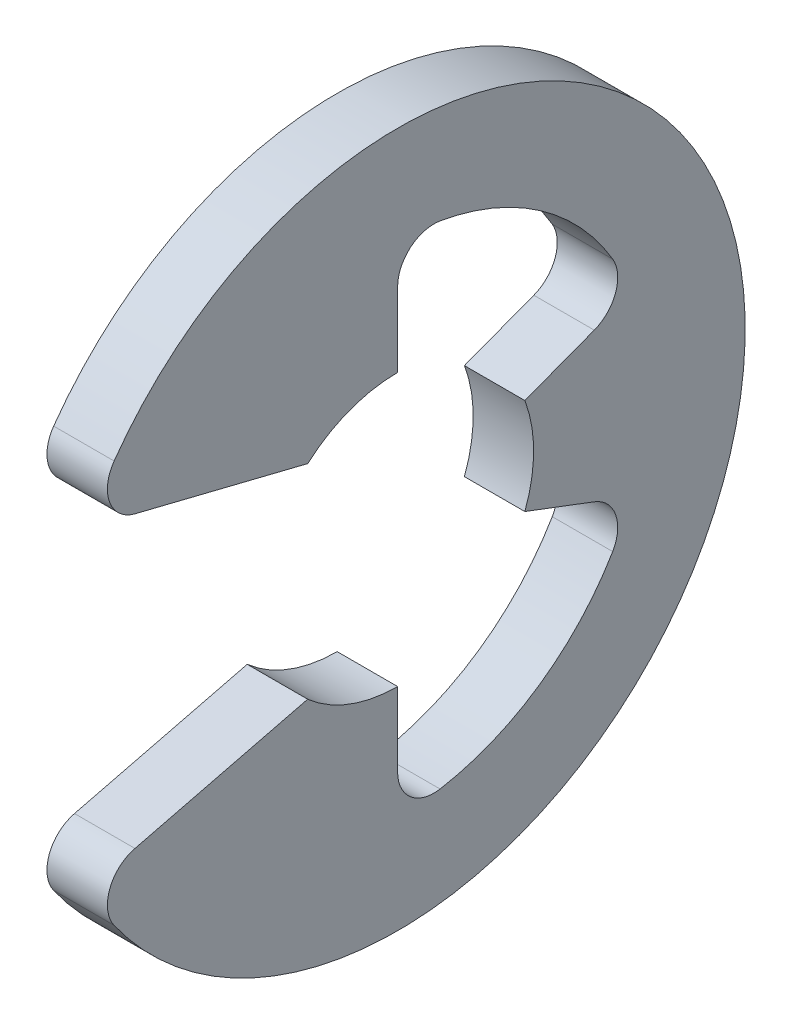
ISO-10303-21;
HEADER;
FILE_DESCRIPTION(('STEP AP214'),'2;1');
FILE_NAME('part.step','',(''),(''),'','','');
FILE_SCHEMA(('AUTOMOTIVE_DESIGN { 1 0 10303 214 1 1 1 1 }'));
ENDSEC;
DATA;
#1=APPLICATION_CONTEXT('core data for automotive mechanical design processes');
#2=APPLICATION_PROTOCOL_DEFINITION('international standard','automotive_design',2000,#1);
#3=PRODUCT_CONTEXT('',#1,'mechanical');
#4=PRODUCT('Part','Part','',(#3));
#5=PRODUCT_RELATED_PRODUCT_CATEGORY('part','',(#4));
#6=PRODUCT_DEFINITION_FORMATION('','',#4);
#7=PRODUCT_DEFINITION_CONTEXT('part definition',#1,'design');
#8=PRODUCT_DEFINITION('design','',#6,#7);
#9=PRODUCT_DEFINITION_SHAPE('','',#8);
#10=(LENGTH_UNIT() NAMED_UNIT(*) SI_UNIT(.MILLI.,.METRE.));
#11=(NAMED_UNIT(*) PLANE_ANGLE_UNIT() SI_UNIT($,.RADIAN.));
#12=(NAMED_UNIT(*) SI_UNIT($,.STERADIAN.) SOLID_ANGLE_UNIT());
#13=UNCERTAINTY_MEASURE_WITH_UNIT(LENGTH_MEASURE(1.E-05),#10,'distance_accuracy_value','');
#14=(GEOMETRIC_REPRESENTATION_CONTEXT(3) GLOBAL_UNCERTAINTY_ASSIGNED_CONTEXT((#13)) GLOBAL_UNIT_ASSIGNED_CONTEXT((#10,
#11,#12)) REPRESENTATION_CONTEXT('',''));
#15=CARTESIAN_POINT('',(0.,0.,0.));
#16=DIRECTION('',(0.,0.,1.));
#17=DIRECTION('',(1.,0.,0.));
#18=AXIS2_PLACEMENT_3D('',#15,#16,#17);
#19=CARTESIAN_POINT('',(0.3,0.,0.));
#20=DIRECTION('',(-1.,0.,0.));
#21=DIRECTION('',(0.,0.,1.));
#22=AXIS2_PLACEMENT_3D('',#19,#20,#21);
#23=CYLINDRICAL_SURFACE('',#22,3.45);
#24=CARTESIAN_POINT('',(0.3,0.,0.));
#25=DIRECTION('',(1.,0.,0.));
#26=DIRECTION('',(0.,0.,-1.));
#27=AXIS2_PLACEMENT_3D('',#24,#25,#26);
#28=CIRCLE('',#27,3.45);
#29=CARTESIAN_POINT('',(0.3,-1.99575242284903,2.8141556933994));
#30=VERTEX_POINT('',#29);
#31=CARTESIAN_POINT('',(0.3,1.99575242284903,2.8141556933994));
#32=VERTEX_POINT('',#31);
#33=EDGE_CURVE('E179',#30,#32,#28,.T.);
#34=ORIENTED_EDGE('',*,*,#33,.F.);
#35=DIRECTION('',(-1.,0.,0.));
#36=VECTOR('',#35,1.);
#37=CARTESIAN_POINT('',(0.3,-1.99575242284903,2.8141556933994));
#38=LINE('',#37,#36);
#39=CARTESIAN_POINT('',(-0.3,-1.99575242284903,2.8141556933994));
#40=VERTEX_POINT('',#39);
#41=EDGE_CURVE('E273',#30,#40,#38,.T.);
#42=ORIENTED_EDGE('',*,*,#41,.T.);
#43=CARTESIAN_POINT('',(-0.3,0.,0.));
#44=DIRECTION('',(1.,0.,0.));
#45=DIRECTION('',(0.,0.,-1.));
#46=AXIS2_PLACEMENT_3D('',#43,#44,#45);
#47=CIRCLE('',#46,3.45);
#48=CARTESIAN_POINT('',(-0.3,1.99575242284903,2.8141556933994));
#49=VERTEX_POINT('',#48);
#50=EDGE_CURVE('E217',#40,#49,#47,.T.);
#51=ORIENTED_EDGE('',*,*,#50,.T.);
#52=DIRECTION('',(-1.,0.,0.));
#53=VECTOR('',#52,1.);
#54=CARTESIAN_POINT('',(0.3,1.99575242284903,2.8141556933994));
#55=LINE('',#54,#53);
#56=EDGE_CURVE('E271',#49,#32,#55,.F.);
#57=ORIENTED_EDGE('',*,*,#56,.T.);
#58=EDGE_LOOP('',(#34,#42,#51,#57));
#59=FACE_BOUND('',#58,.T.);
#60=ADVANCED_FACE('F41',(#59),#23,.T.);
#61=CARTESIAN_POINT('',(0.3,1.55535385551941,3.07950878942095));
#62=DIRECTION('',(0.,0.970536829925373,-0.240952820606871));
#63=DIRECTION('',(0.,0.240952820606871,0.970536829925373));
#64=AXIS2_PLACEMENT_3D('',#61,#62,#63);
#65=PLANE('',#64);
#66=DIRECTION('',(0.,-0.240952820606871,-0.970536829925373));
#67=VECTOR('',#66,1.);
#68=CARTESIAN_POINT('',(0.3,1.55535385551941,3.07950878942095));
#69=LINE('',#68,#67);
#70=CARTESIAN_POINT('',(0.3,1.43810673734382,2.60724767994141));
#71=VERTEX_POINT('',#70);
#72=CARTESIAN_POINT('',(0.3,1.0125,0.8929410674843));
#73=VERTEX_POINT('',#72);
#74=EDGE_CURVE('E165',#71,#73,#69,.T.);
#75=ORIENTED_EDGE('',*,*,#74,.F.);
#76=DIRECTION('',(-1.,0.,0.));
#77=VECTOR('',#76,1.);
#78=CARTESIAN_POINT('',(0.3,1.43810673734382,2.60724767994141));
#79=LINE('',#78,#77);
#80=CARTESIAN_POINT('',(-0.3,1.43810673734382,2.60724767994141));
#81=VERTEX_POINT('',#80);
#82=EDGE_CURVE('E285',#71,#81,#79,.T.);
#83=ORIENTED_EDGE('',*,*,#82,.T.);
#84=DIRECTION('',(0.,-0.240952820606871,-0.970536829925373));
#85=VECTOR('',#84,1.);
#86=CARTESIAN_POINT('',(-0.3,1.55535385551941,3.07950878942095));
#87=LINE('',#86,#85);
#88=CARTESIAN_POINT('',(-0.3,1.0125,0.8929410674843));
#89=VERTEX_POINT('',#88);
#90=EDGE_CURVE('E185',#81,#89,#87,.T.);
#91=ORIENTED_EDGE('',*,*,#90,.T.);
#92=DIRECTION('',(-1.,0.,0.));
#93=VECTOR('',#92,1.);
#94=CARTESIAN_POINT('',(0.3,1.0125,0.8929410674843));
#95=LINE('',#94,#93);
#96=EDGE_CURVE('E182',#73,#89,#95,.T.);
#97=ORIENTED_EDGE('',*,*,#96,.F.);
#98=EDGE_LOOP('',(#75,#83,#91,#97));
#99=FACE_BOUND('',#98,.T.);
#100=ADVANCED_FACE('F183',(#99),#65,.F.);
#101=CARTESIAN_POINT('',(0.3,0.,0.));
#102=DIRECTION('',(-1.,0.,0.));
#103=DIRECTION('',(0.,0.,1.));
#104=AXIS2_PLACEMENT_3D('',#101,#102,#103);
#105=CYLINDRICAL_SURFACE('',#104,1.35);
#106=CARTESIAN_POINT('',(-0.3,0.,0.));
#107=DIRECTION('',(-1.,0.,0.));
#108=DIRECTION('',(0.,0.,1.));
#109=AXIS2_PLACEMENT_3D('',#106,#107,#108);
#110=CIRCLE('',#109,1.35);
#111=CARTESIAN_POINT('',(-0.3,1.35,0.));
#112=VERTEX_POINT('',#111);
#113=EDGE_CURVE('E221',#89,#112,#110,.T.);
#114=ORIENTED_EDGE('',*,*,#113,.T.);
#115=DIRECTION('',(-1.,0.,0.));
#116=VECTOR('',#115,1.);
#117=CARTESIAN_POINT('',(0.3,1.35,0.));
#118=LINE('',#117,#116);
#119=CARTESIAN_POINT('',(0.3,1.35,0.));
#120=VERTEX_POINT('',#119);
#121=EDGE_CURVE('E189',#120,#112,#118,.T.);
#122=ORIENTED_EDGE('',*,*,#121,.F.);
#123=CARTESIAN_POINT('',(0.3,0.,0.));
#124=DIRECTION('',(-1.,0.,0.));
#125=DIRECTION('',(0.,0.,1.));
#126=AXIS2_PLACEMENT_3D('',#123,#124,#125);
#127=CIRCLE('',#126,1.35);
#128=EDGE_CURVE('E171',#73,#120,#127,.T.);
#129=ORIENTED_EDGE('',*,*,#128,.F.);
#130=ORIENTED_EDGE('',*,*,#96,.T.);
#131=EDGE_LOOP('',(#114,#122,#129,#130));
#132=FACE_BOUND('',#131,.T.);
#133=ADVANCED_FACE('F191',(#132),#105,.F.);
#134=CARTESIAN_POINT('',(0.3,1.35,0.));
#135=DIRECTION('',(0.,0.,1.));
#136=DIRECTION('',(0.,-1.,0.));
#137=AXIS2_PLACEMENT_3D('',#134,#135,#136);
#138=PLANE('',#137);
#139=DIRECTION('',(0.,1.,0.));
#140=VECTOR('',#139,1.);
#141=CARTESIAN_POINT('',(-0.3,1.35,0.));
#142=LINE('',#141,#140);
#143=CARTESIAN_POINT('',(-0.3,2.08659165249111,0.));
#144=VERTEX_POINT('',#143);
#145=EDGE_CURVE('E223',#112,#144,#142,.T.);
#146=ORIENTED_EDGE('',*,*,#145,.T.);
#147=DIRECTION('',(1.,0.,0.));
#148=VECTOR('',#147,1.);
#149=CARTESIAN_POINT('',(0.3,2.08659165249111,0.));
#150=LINE('',#149,#148);
#151=CARTESIAN_POINT('',(0.3,2.08659165249111,0.));
#152=VERTEX_POINT('',#151);
#153=EDGE_CURVE('E269',#144,#152,#150,.T.);
#154=ORIENTED_EDGE('',*,*,#153,.T.);
#155=DIRECTION('',(0.,1.,0.));
#156=VECTOR('',#155,1.);
#157=CARTESIAN_POINT('',(0.3,1.35,0.));
#158=LINE('',#157,#156);
#159=EDGE_CURVE('E194',#120,#152,#158,.T.);
#160=ORIENTED_EDGE('',*,*,#159,.F.);
#161=ORIENTED_EDGE('',*,*,#121,.T.);
#162=EDGE_LOOP('',(#146,#154,#160,#161));
#163=FACE_BOUND('',#162,.T.);
#164=ADVANCED_FACE('F393',(#163),#138,.F.);
#165=CARTESIAN_POINT('',(0.3,0.,0.));
#166=DIRECTION('',(-1.,0.,0.));
#167=DIRECTION('',(0.,0.,1.));
#168=AXIS2_PLACEMENT_3D('',#165,#166,#167);
#169=CYLINDRICAL_SURFACE('',#168,2.47741935483871);
#170=CARTESIAN_POINT('',(0.3,0.,0.));
#171=DIRECTION('',(-1.,0.,0.));
#172=DIRECTION('',(0.,0.,-1.));
#173=AXIS2_PLACEMENT_3D('',#170,#171,#172);
#174=CIRCLE('',#173,2.47741935483871);
#175=CARTESIAN_POINT('',(0.3,2.44135037951428,-0.421206581352832));
#176=VERTEX_POINT('',#175);
#177=CARTESIAN_POINT('',(0.3,1.25715038342261,-2.13475515532574));
#178=VERTEX_POINT('',#177);
#179=EDGE_CURVE('E196',#176,#178,#174,.T.);
#180=ORIENTED_EDGE('',*,*,#179,.F.);
#181=DIRECTION('',(-1.,0.,0.));
#182=VECTOR('',#181,1.);
#183=CARTESIAN_POINT('',(0.3,2.44135037951428,-0.421206581352832));
#184=LINE('',#183,#182);
#185=CARTESIAN_POINT('',(-0.3,2.44135037951428,-0.421206581352832));
#186=VERTEX_POINT('',#185);
#187=EDGE_CURVE('E266',#176,#186,#184,.T.);
#188=ORIENTED_EDGE('',*,*,#187,.T.);
#189=CARTESIAN_POINT('',(-0.3,0.,0.));
#190=DIRECTION('',(-1.,0.,0.));
#191=DIRECTION('',(0.,0.,-1.));
#192=AXIS2_PLACEMENT_3D('',#189,#190,#191);
#193=CIRCLE('',#192,2.47741935483871);
#194=CARTESIAN_POINT('',(-0.3,1.25715038342261,-2.13475515532574));
#195=VERTEX_POINT('',#194);
#196=EDGE_CURVE('E226',#186,#195,#193,.T.);
#197=ORIENTED_EDGE('',*,*,#196,.T.);
#198=DIRECTION('',(-1.,0.,0.));
#199=VECTOR('',#198,1.);
#200=CARTESIAN_POINT('',(0.3,1.25715038342261,-2.13475515532574));
#201=LINE('',#200,#199);
#202=EDGE_CURVE('E264',#195,#178,#201,.F.);
#203=ORIENTED_EDGE('',*,*,#202,.T.);
#204=EDGE_LOOP('',(#180,#188,#197,#203));
#205=FACE_BOUND('',#204,.T.);
#206=ADVANCED_FACE('F313',(#205),#169,.F.);
#207=CARTESIAN_POINT('',(0.3,0.477297077300919,-1.26280936803621));
#208=DIRECTION('',(0.,-0.935414346693484,-0.353553390593278));
#209=DIRECTION('',(0.,0.353553390593278,-0.935414346693484));
#210=AXIS2_PLACEMENT_3D('',#207,#208,#209);
#211=PLANE('',#210);
#212=DIRECTION('',(0.,-0.353553390593278,0.935414346693484));
#213=VECTOR('',#212,1.);
#214=CARTESIAN_POINT('',(0.3,0.477297077300919,-1.26280936803621));
#215=LINE('',#214,#213);
#216=CARTESIAN_POINT('',(0.3,0.737721553521856,-1.95182776743105));
#217=VERTEX_POINT('',#216);
#218=CARTESIAN_POINT('',(0.3,0.477297077300919,-1.26280936803621));
#219=VERTEX_POINT('',#218);
#220=EDGE_CURVE('E201',#217,#219,#215,.T.);
#221=ORIENTED_EDGE('',*,*,#220,.F.);
#222=DIRECTION('',(1.,0.,0.));
#223=VECTOR('',#222,1.);
#224=CARTESIAN_POINT('',(-0.3,0.737721553521856,-1.95182776743105));
#225=LINE('',#224,#223);
#226=CARTESIAN_POINT('',(-0.3,0.737721553521856,-1.95182776743105));
#227=VERTEX_POINT('',#226);
#228=EDGE_CURVE('E288',#217,#227,#225,.F.);
#229=ORIENTED_EDGE('',*,*,#228,.T.);
#230=DIRECTION('',(0.,-0.353553390593278,0.935414346693484));
#231=VECTOR('',#230,1.);
#232=CARTESIAN_POINT('',(-0.3,0.477297077300919,-1.26280936803621));
#233=LINE('',#232,#231);
#234=CARTESIAN_POINT('',(-0.3,0.477297077300919,-1.26280936803621));
#235=VERTEX_POINT('',#234);
#236=EDGE_CURVE('E229',#227,#235,#233,.T.);
#237=ORIENTED_EDGE('',*,*,#236,.T.);
#238=DIRECTION('',(-1.,0.,0.));
#239=VECTOR('',#238,1.);
#240=CARTESIAN_POINT('',(0.3,0.477297077300919,-1.26280936803621));
#241=LINE('',#240,#239);
#242=EDGE_CURVE('E253',#219,#235,#241,.T.);
#243=ORIENTED_EDGE('',*,*,#242,.F.);
#244=EDGE_LOOP('',(#221,#229,#237,#243));
#245=FACE_BOUND('',#244,.T.);
#246=ADVANCED_FACE('F316',(#245),#211,.F.);
#247=CARTESIAN_POINT('',(0.3,0.,0.));
#248=DIRECTION('',(-1.,0.,0.));
#249=DIRECTION('',(0.,0.,1.));
#250=AXIS2_PLACEMENT_3D('',#247,#248,#249);
#251=CYLINDRICAL_SURFACE('',#250,1.35);
#252=CARTESIAN_POINT('',(-0.3,0.,0.));
#253=DIRECTION('',(-1.,0.,0.));
#254=DIRECTION('',(0.,0.,1.));
#255=AXIS2_PLACEMENT_3D('',#252,#253,#254);
#256=CIRCLE('',#255,1.35);
#257=CARTESIAN_POINT('',(-0.3,-0.477297077300919,-1.26280936803621));
#258=VERTEX_POINT('',#257);
#259=EDGE_CURVE('E231',#235,#258,#256,.T.);
#260=ORIENTED_EDGE('',*,*,#259,.T.);
#261=DIRECTION('',(-1.,0.,0.));
#262=VECTOR('',#261,1.);
#263=CARTESIAN_POINT('',(0.3,-0.477297077300919,-1.26280936803621));
#264=LINE('',#263,#262);
#265=CARTESIAN_POINT('',(0.3,-0.477297077300919,-1.26280936803621));
#266=VERTEX_POINT('',#265);
#267=EDGE_CURVE('E250',#266,#258,#264,.T.);
#268=ORIENTED_EDGE('',*,*,#267,.F.);
#269=CARTESIAN_POINT('',(0.3,0.,0.));
#270=DIRECTION('',(-1.,0.,0.));
#271=DIRECTION('',(0.,0.,1.));
#272=AXIS2_PLACEMENT_3D('',#269,#270,#271);
#273=CIRCLE('',#272,1.35);
#274=EDGE_CURVE('E203',#219,#266,#273,.T.);
#275=ORIENTED_EDGE('',*,*,#274,.F.);
#276=ORIENTED_EDGE('',*,*,#242,.T.);
#277=EDGE_LOOP('',(#260,#268,#275,#276));
#278=FACE_BOUND('',#277,.T.);
#279=ADVANCED_FACE('F322',(#278),#251,.F.);
#280=CARTESIAN_POINT('',(0.3,-0.477297077300919,-1.26280936803621));
#281=DIRECTION('',(0.,0.935414346693484,-0.353553390593277));
#282=DIRECTION('',(0.,0.353553390593277,0.935414346693484));
#283=AXIS2_PLACEMENT_3D('',#280,#281,#282);
#284=PLANE('',#283);
#285=DIRECTION('',(0.,-0.353553390593277,-0.935414346693484));
#286=VECTOR('',#285,1.);
#287=CARTESIAN_POINT('',(-0.3,-0.477297077300919,-1.26280936803621));
#288=LINE('',#287,#286);
#289=CARTESIAN_POINT('',(-0.3,-0.737721553521855,-1.95182776743105));
#290=VERTEX_POINT('',#289);
#291=EDGE_CURVE('E233',#258,#290,#288,.T.);
#292=ORIENTED_EDGE('',*,*,#291,.T.);
#293=DIRECTION('',(1.,0.,0.));
#294=VECTOR('',#293,1.);
#295=CARTESIAN_POINT('',(0.3,-0.737721553521855,-1.95182776743105));
#296=LINE('',#295,#294);
#297=CARTESIAN_POINT('',(0.3,-0.737721553521855,-1.95182776743105));
#298=VERTEX_POINT('',#297);
#299=EDGE_CURVE('E56',#290,#298,#296,.T.);
#300=ORIENTED_EDGE('',*,*,#299,.T.);
#301=DIRECTION('',(0.,-0.353553390593277,-0.935414346693484));
#302=VECTOR('',#301,1.);
#303=CARTESIAN_POINT('',(0.3,-0.477297077300919,-1.26280936803621));
#304=LINE('',#303,#302);
#305=EDGE_CURVE('E205',#266,#298,#304,.T.);
#306=ORIENTED_EDGE('',*,*,#305,.F.);
#307=ORIENTED_EDGE('',*,*,#267,.T.);
#308=EDGE_LOOP('',(#292,#300,#306,#307));
#309=FACE_BOUND('',#308,.T.);
#310=ADVANCED_FACE('F324',(#309),#284,.F.);
#311=CARTESIAN_POINT('',(0.3,0.,0.));
#312=DIRECTION('',(-1.,0.,0.));
#313=DIRECTION('',(0.,0.,1.));
#314=AXIS2_PLACEMENT_3D('',#311,#312,#313);
#315=CYLINDRICAL_SURFACE('',#314,2.47741935483871);
#316=CARTESIAN_POINT('',(-0.3,0.,0.));
#317=DIRECTION('',(-1.,0.,0.));
#318=DIRECTION('',(0.,0.,-1.));
#319=AXIS2_PLACEMENT_3D('',#316,#317,#318);
#320=CIRCLE('',#319,2.47741935483871);
#321=CARTESIAN_POINT('',(-0.3,-1.25715038342261,-2.13475515532574));
#322=VERTEX_POINT('',#321);
#323=CARTESIAN_POINT('',(-0.3,-2.44135037951428,-0.421206581352832));
#324=VERTEX_POINT('',#323);
#325=EDGE_CURVE('E235',#322,#324,#320,.T.);
#326=ORIENTED_EDGE('',*,*,#325,.T.);
#327=DIRECTION('',(-1.,0.,0.));
#328=VECTOR('',#327,1.);
#329=CARTESIAN_POINT('',(0.3,-2.44135037951428,-0.421206581352832));
#330=LINE('',#329,#328);
#331=CARTESIAN_POINT('',(0.3,-2.44135037951428,-0.421206581352832));
#332=VERTEX_POINT('',#331);
#333=EDGE_CURVE('E262',#324,#332,#330,.F.);
#334=ORIENTED_EDGE('',*,*,#333,.T.);
#335=CARTESIAN_POINT('',(0.3,0.,0.));
#336=DIRECTION('',(-1.,0.,0.));
#337=DIRECTION('',(0.,0.,-1.));
#338=AXIS2_PLACEMENT_3D('',#335,#336,#337);
#339=CIRCLE('',#338,2.47741935483871);
#340=CARTESIAN_POINT('',(0.3,-1.25715038342261,-2.13475515532574));
#341=VERTEX_POINT('',#340);
#342=EDGE_CURVE('E207',#341,#332,#339,.T.);
#343=ORIENTED_EDGE('',*,*,#342,.F.);
#344=DIRECTION('',(-1.,0.,0.));
#345=VECTOR('',#344,1.);
#346=CARTESIAN_POINT('',(0.3,-1.25715038342261,-2.13475515532574));
#347=LINE('',#346,#345);
#348=EDGE_CURVE('E259',#341,#322,#347,.T.);
#349=ORIENTED_EDGE('',*,*,#348,.T.);
#350=EDGE_LOOP('',(#326,#334,#343,#349));
#351=FACE_BOUND('',#350,.T.);
#352=ADVANCED_FACE('F326',(#351),#315,.F.);
#353=CARTESIAN_POINT('',(0.3,-1.35,0.));
#354=DIRECTION('',(0.,0.,1.));
#355=DIRECTION('',(0.,-1.,0.));
#356=AXIS2_PLACEMENT_3D('',#353,#354,#355);
#357=PLANE('',#356);
#358=DIRECTION('',(0.,1.,0.));
#359=VECTOR('',#358,1.);
#360=CARTESIAN_POINT('',(0.3,-1.35,0.));
#361=LINE('',#360,#359);
#362=CARTESIAN_POINT('',(0.3,-2.08659165249111,0.));
#363=VERTEX_POINT('',#362);
#364=CARTESIAN_POINT('',(0.3,-1.35,0.));
#365=VERTEX_POINT('',#364);
#366=EDGE_CURVE('E210',#363,#365,#361,.T.);
#367=ORIENTED_EDGE('',*,*,#366,.F.);
#368=DIRECTION('',(1.,0.,0.));
#369=VECTOR('',#368,1.);
#370=CARTESIAN_POINT('',(-0.3,-2.08659165249111,0.));
#371=LINE('',#370,#369);
#372=CARTESIAN_POINT('',(-0.3,-2.08659165249111,0.));
#373=VERTEX_POINT('',#372);
#374=EDGE_CURVE('E188',#363,#373,#371,.F.);
#375=ORIENTED_EDGE('',*,*,#374,.T.);
#376=DIRECTION('',(0.,1.,0.));
#377=VECTOR('',#376,1.);
#378=CARTESIAN_POINT('',(-0.3,-1.35,0.));
#379=LINE('',#378,#377);
#380=CARTESIAN_POINT('',(-0.3,-1.35,0.));
#381=VERTEX_POINT('',#380);
#382=EDGE_CURVE('E238',#373,#381,#379,.T.);
#383=ORIENTED_EDGE('',*,*,#382,.T.);
#384=DIRECTION('',(-1.,0.,0.));
#385=VECTOR('',#384,1.);
#386=CARTESIAN_POINT('',(0.3,-1.35,0.));
#387=LINE('',#386,#385);
#388=EDGE_CURVE('E247',#365,#381,#387,.T.);
#389=ORIENTED_EDGE('',*,*,#388,.F.);
#390=EDGE_LOOP('',(#367,#375,#383,#389));
#391=FACE_BOUND('',#390,.T.);
#392=ADVANCED_FACE('F332',(#391),#357,.F.);
#393=CARTESIAN_POINT('',(0.3,0.,0.));
#394=DIRECTION('',(-1.,0.,0.));
#395=DIRECTION('',(0.,0.,1.));
#396=AXIS2_PLACEMENT_3D('',#393,#394,#395);
#397=CYLINDRICAL_SURFACE('',#396,1.35);
#398=CARTESIAN_POINT('',(-0.3,0.,0.));
#399=DIRECTION('',(-1.,0.,0.));
#400=DIRECTION('',(0.,0.,-1.));
#401=AXIS2_PLACEMENT_3D('',#398,#399,#400);
#402=CIRCLE('',#401,1.35);
#403=CARTESIAN_POINT('',(-0.3,-1.0125,0.8929410674843));
#404=VERTEX_POINT('',#403);
#405=EDGE_CURVE('E240',#381,#404,#402,.T.);
#406=ORIENTED_EDGE('',*,*,#405,.T.);
#407=DIRECTION('',(-1.,0.,0.));
#408=VECTOR('',#407,1.);
#409=CARTESIAN_POINT('',(0.3,-1.0125,0.8929410674843));
#410=LINE('',#409,#408);
#411=CARTESIAN_POINT('',(0.3,-1.0125,0.8929410674843));
#412=VERTEX_POINT('',#411);
#413=EDGE_CURVE('E216',#412,#404,#410,.T.);
#414=ORIENTED_EDGE('',*,*,#413,.F.);
#415=CARTESIAN_POINT('',(0.3,0.,0.));
#416=DIRECTION('',(-1.,0.,0.));
#417=DIRECTION('',(0.,0.,-1.));
#418=AXIS2_PLACEMENT_3D('',#415,#416,#417);
#419=CIRCLE('',#418,1.35);
#420=EDGE_CURVE('E212',#365,#412,#419,.T.);
#421=ORIENTED_EDGE('',*,*,#420,.F.);
#422=ORIENTED_EDGE('',*,*,#388,.T.);
#423=EDGE_LOOP('',(#406,#414,#421,#422));
#424=FACE_BOUND('',#423,.T.);
#425=ADVANCED_FACE('F383',(#424),#397,.F.);
#426=CARTESIAN_POINT('',(0.3,-1.55535385551941,3.07950878942095));
#427=DIRECTION('',(0.,-0.970536829925373,-0.240952820606872));
#428=DIRECTION('',(0.,0.240952820606872,-0.970536829925373));
#429=AXIS2_PLACEMENT_3D('',#426,#427,#428);
#430=PLANE('',#429);
#431=DIRECTION('',(0.,-0.240952820606872,0.970536829925373));
#432=VECTOR('',#431,1.);
#433=CARTESIAN_POINT('',(-0.3,-1.55535385551941,3.07950878942095));
#434=LINE('',#433,#432);
#435=CARTESIAN_POINT('',(-0.3,-1.43810673734382,2.60724767994141));
#436=VERTEX_POINT('',#435);
#437=EDGE_CURVE('E242',#404,#436,#434,.T.);
#438=ORIENTED_EDGE('',*,*,#437,.T.);
#439=DIRECTION('',(-1.,0.,0.));
#440=VECTOR('',#439,1.);
#441=CARTESIAN_POINT('',(0.3,-1.43810673734382,2.60724767994141));
#442=LINE('',#441,#440);
#443=CARTESIAN_POINT('',(0.3,-1.43810673734382,2.60724767994141));
#444=VERTEX_POINT('',#443);
#445=EDGE_CURVE('E280',#436,#444,#442,.F.);
#446=ORIENTED_EDGE('',*,*,#445,.T.);
#447=DIRECTION('',(0.,-0.240952820606872,0.970536829925373));
#448=VECTOR('',#447,1.);
#449=CARTESIAN_POINT('',(0.3,-1.55535385551941,3.07950878942095));
#450=LINE('',#449,#448);
#451=EDGE_CURVE('E214',#412,#444,#450,.T.);
#452=ORIENTED_EDGE('',*,*,#451,.F.);
#453=ORIENTED_EDGE('',*,*,#413,.T.);
#454=EDGE_LOOP('',(#438,#446,#452,#453));
#455=FACE_BOUND('',#454,.T.);
#456=ADVANCED_FACE('F430',(#455),#430,.F.);
#457=CARTESIAN_POINT('',(0.3,0.,0.));
#458=DIRECTION('',(1.,0.,0.));
#459=DIRECTION('',(0.,0.,-1.));
#460=AXIS2_PLACEMENT_3D('',#457,#458,#459);
#461=PLANE('',#460);
#462=ORIENTED_EDGE('',*,*,#451,.T.);
#463=CARTESIAN_POINT('',(0.3,-1.78749999611696,2.52050466452294));
#464=DIRECTION('',(1.,0.,0.));
#465=DIRECTION('',(0.,0.,-1.));
#466=AXIS2_PLACEMENT_3D('',#463,#464,#465);
#467=CIRCLE('',#466,0.36);
#468=EDGE_CURVE('E283',#444,#30,#467,.T.);
#469=ORIENTED_EDGE('',*,*,#468,.T.);
#470=ORIENTED_EDGE('',*,*,#33,.T.);
#471=CARTESIAN_POINT('',(0.3,1.78749999611695,2.52050466452294));
#472=DIRECTION('',(1.,0.,0.));
#473=DIRECTION('',(0.,0.,-1.));
#474=AXIS2_PLACEMENT_3D('',#471,#472,#473);
#475=CIRCLE('',#474,0.36);
#476=EDGE_CURVE('E175',#32,#71,#475,.T.);
#477=ORIENTED_EDGE('',*,*,#476,.T.);
#478=ORIENTED_EDGE('',*,*,#74,.T.);
#479=ORIENTED_EDGE('',*,*,#128,.T.);
#480=ORIENTED_EDGE('',*,*,#159,.T.);
#481=CARTESIAN_POINT('',(0.3,2.08659165249111,-0.359999999999998));
#482=DIRECTION('',(1.,0.,0.));
#483=DIRECTION('',(0.,0.,-1.));
#484=AXIS2_PLACEMENT_3D('',#481,#482,#483);
#485=CIRCLE('',#484,0.36);
#486=EDGE_CURVE('E297',#152,#176,#485,.F.);
#487=ORIENTED_EDGE('',*,*,#486,.T.);
#488=ORIENTED_EDGE('',*,*,#179,.T.);
#489=CARTESIAN_POINT('',(0.3,1.07447071833151,-1.82454854681747));
#490=DIRECTION('',(1.,0.,0.));
#491=DIRECTION('',(0.,0.,-1.));
#492=AXIS2_PLACEMENT_3D('',#489,#490,#491);
#493=CIRCLE('',#492,0.36);
#494=EDGE_CURVE('E11',#178,#217,#493,.F.);
#495=ORIENTED_EDGE('',*,*,#494,.T.);
#496=ORIENTED_EDGE('',*,*,#220,.T.);
#497=ORIENTED_EDGE('',*,*,#274,.T.);
#498=ORIENTED_EDGE('',*,*,#305,.T.);
#499=CARTESIAN_POINT('',(0.3,-1.07447071833151,-1.82454854681747));
#500=DIRECTION('',(1.,0.,0.));
#501=DIRECTION('',(0.,0.,-1.));
#502=AXIS2_PLACEMENT_3D('',#499,#500,#501);
#503=CIRCLE('',#502,0.36);
#504=EDGE_CURVE('E301',#298,#341,#503,.F.);
#505=ORIENTED_EDGE('',*,*,#504,.T.);
#506=ORIENTED_EDGE('',*,*,#342,.T.);
#507=CARTESIAN_POINT('',(0.3,-2.08659165249111,-0.359999999999999));
#508=DIRECTION('',(1.,0.,0.));
#509=DIRECTION('',(0.,0.,-1.));
#510=AXIS2_PLACEMENT_3D('',#507,#508,#509);
#511=CIRCLE('',#510,0.36);
#512=EDGE_CURVE('E293',#332,#363,#511,.F.);
#513=ORIENTED_EDGE('',*,*,#512,.T.);
#514=ORIENTED_EDGE('',*,*,#366,.T.);
#515=ORIENTED_EDGE('',*,*,#420,.T.);
#516=EDGE_LOOP('',(#462,#469,#470,#477,#478,#479,#480,#487,#488,#495,#496,#497,#498,#505,#506,
#513,#514,#515));
#517=FACE_BOUND('',#516,.T.);
#518=ADVANCED_FACE('F168',(#517),#461,.T.);
#519=CARTESIAN_POINT('',(-0.3,0.,0.));
#520=DIRECTION('',(1.,0.,0.));
#521=DIRECTION('',(0.,0.,-1.));
#522=AXIS2_PLACEMENT_3D('',#519,#520,#521);
#523=PLANE('',#522);
#524=ORIENTED_EDGE('',*,*,#50,.F.);
#525=CARTESIAN_POINT('',(-0.3,-1.78749999611696,2.52050466452294));
#526=DIRECTION('',(1.,0.,0.));
#527=DIRECTION('',(0.,0.,-1.));
#528=AXIS2_PLACEMENT_3D('',#525,#526,#527);
#529=CIRCLE('',#528,0.36);
#530=EDGE_CURVE('E278',#40,#436,#529,.F.);
#531=ORIENTED_EDGE('',*,*,#530,.T.);
#532=ORIENTED_EDGE('',*,*,#437,.F.);
#533=ORIENTED_EDGE('',*,*,#405,.F.);
#534=ORIENTED_EDGE('',*,*,#382,.F.);
#535=CARTESIAN_POINT('',(-0.3,-2.08659165249111,-0.359999999999999));
#536=DIRECTION('',(1.,0.,0.));
#537=DIRECTION('',(0.,0.,-1.));
#538=AXIS2_PLACEMENT_3D('',#535,#536,#537);
#539=CIRCLE('',#538,0.36);
#540=EDGE_CURVE('E291',#373,#324,#539,.T.);
#541=ORIENTED_EDGE('',*,*,#540,.T.);
#542=ORIENTED_EDGE('',*,*,#325,.F.);
#543=CARTESIAN_POINT('',(-0.3,-1.07447071833151,-1.82454854681747));
#544=DIRECTION('',(1.,0.,0.));
#545=DIRECTION('',(0.,0.,-1.));
#546=AXIS2_PLACEMENT_3D('',#543,#544,#545);
#547=CIRCLE('',#546,0.36);
#548=EDGE_CURVE('E299',#322,#290,#547,.T.);
#549=ORIENTED_EDGE('',*,*,#548,.T.);
#550=ORIENTED_EDGE('',*,*,#291,.F.);
#551=ORIENTED_EDGE('',*,*,#259,.F.);
#552=ORIENTED_EDGE('',*,*,#236,.F.);
#553=CARTESIAN_POINT('',(-0.3,1.07447071833151,-1.82454854681747));
#554=DIRECTION('',(1.,0.,0.));
#555=DIRECTION('',(0.,0.,-1.));
#556=AXIS2_PLACEMENT_3D('',#553,#554,#555);
#557=CIRCLE('',#556,0.36);
#558=EDGE_CURVE('E49',#227,#195,#557,.T.);
#559=ORIENTED_EDGE('',*,*,#558,.T.);
#560=ORIENTED_EDGE('',*,*,#196,.F.);
#561=CARTESIAN_POINT('',(-0.3,2.08659165249111,-0.359999999999998));
#562=DIRECTION('',(1.,0.,0.));
#563=DIRECTION('',(0.,0.,-1.));
#564=AXIS2_PLACEMENT_3D('',#561,#562,#563);
#565=CIRCLE('',#564,0.36);
#566=EDGE_CURVE('E295',#186,#144,#565,.T.);
#567=ORIENTED_EDGE('',*,*,#566,.T.);
#568=ORIENTED_EDGE('',*,*,#145,.F.);
#569=ORIENTED_EDGE('',*,*,#113,.F.);
#570=ORIENTED_EDGE('',*,*,#90,.F.);
#571=CARTESIAN_POINT('',(-0.3,1.78749999611695,2.52050466452294));
#572=DIRECTION('',(1.,0.,0.));
#573=DIRECTION('',(0.,0.,-1.));
#574=AXIS2_PLACEMENT_3D('',#571,#572,#573);
#575=CIRCLE('',#574,0.36);
#576=EDGE_CURVE('E276',#81,#49,#575,.F.);
#577=ORIENTED_EDGE('',*,*,#576,.T.);
#578=EDGE_LOOP('',(#524,#531,#532,#533,#534,#541,#542,#549,#550,#551,#552,#559,#560,#567,#568,
#569,#570,#577));
#579=FACE_BOUND('',#578,.T.);
#580=ADVANCED_FACE('F306',(#579),#523,.F.);
#581=CARTESIAN_POINT('',(0.3,-2.08659165249111,-0.359999999999999));
#582=DIRECTION('',(-1.,0.,0.));
#583=DIRECTION('',(0.,0.,1.));
#584=AXIS2_PLACEMENT_3D('',#581,#582,#583);
#585=CYLINDRICAL_SURFACE('',#584,0.36);
#586=ORIENTED_EDGE('',*,*,#512,.F.);
#587=ORIENTED_EDGE('',*,*,#333,.F.);
#588=ORIENTED_EDGE('',*,*,#540,.F.);
#589=ORIENTED_EDGE('',*,*,#374,.F.);
#590=EDGE_LOOP('',(#586,#587,#588,#589));
#591=FACE_BOUND('',#590,.T.);
#592=ADVANCED_FACE('F348',(#591),#585,.F.);
#593=CARTESIAN_POINT('',(0.3,2.08659165249111,-0.359999999999998));
#594=DIRECTION('',(-1.,0.,0.));
#595=DIRECTION('',(0.,0.,1.));
#596=AXIS2_PLACEMENT_3D('',#593,#594,#595);
#597=CYLINDRICAL_SURFACE('',#596,0.36);
#598=ORIENTED_EDGE('',*,*,#486,.F.);
#599=ORIENTED_EDGE('',*,*,#153,.F.);
#600=ORIENTED_EDGE('',*,*,#566,.F.);
#601=ORIENTED_EDGE('',*,*,#187,.F.);
#602=EDGE_LOOP('',(#598,#599,#600,#601));
#603=FACE_BOUND('',#602,.T.);
#604=ADVANCED_FACE('F351',(#603),#597,.F.);
#605=CARTESIAN_POINT('',(0.3,-1.78749999611696,2.52050466452294));
#606=DIRECTION('',(-1.,0.,0.));
#607=DIRECTION('',(0.,0.,1.));
#608=AXIS2_PLACEMENT_3D('',#605,#606,#607);
#609=CYLINDRICAL_SURFACE('',#608,0.36);
#610=ORIENTED_EDGE('',*,*,#468,.F.);
#611=ORIENTED_EDGE('',*,*,#445,.F.);
#612=ORIENTED_EDGE('',*,*,#530,.F.);
#613=ORIENTED_EDGE('',*,*,#41,.F.);
#614=EDGE_LOOP('',(#610,#611,#612,#613));
#615=FACE_BOUND('',#614,.T.);
#616=ADVANCED_FACE('F355',(#615),#609,.T.);
#617=CARTESIAN_POINT('',(0.3,1.78749999611695,2.52050466452294));
#618=DIRECTION('',(-1.,0.,0.));
#619=DIRECTION('',(0.,0.,1.));
#620=AXIS2_PLACEMENT_3D('',#617,#618,#619);
#621=CYLINDRICAL_SURFACE('',#620,0.36);
#622=ORIENTED_EDGE('',*,*,#476,.F.);
#623=ORIENTED_EDGE('',*,*,#56,.F.);
#624=ORIENTED_EDGE('',*,*,#576,.F.);
#625=ORIENTED_EDGE('',*,*,#82,.F.);
#626=EDGE_LOOP('',(#622,#623,#624,#625));
#627=FACE_BOUND('',#626,.T.);
#628=ADVANCED_FACE('F359',(#627),#621,.T.);
#629=CARTESIAN_POINT('',(0.3,-1.07447071833151,-1.82454854681747));
#630=DIRECTION('',(-1.,0.,0.));
#631=DIRECTION('',(0.,0.,1.));
#632=AXIS2_PLACEMENT_3D('',#629,#630,#631);
#633=CYLINDRICAL_SURFACE('',#632,0.36);
#634=ORIENTED_EDGE('',*,*,#504,.F.);
#635=ORIENTED_EDGE('',*,*,#299,.F.);
#636=ORIENTED_EDGE('',*,*,#548,.F.);
#637=ORIENTED_EDGE('',*,*,#348,.F.);
#638=EDGE_LOOP('',(#634,#635,#636,#637));
#639=FACE_BOUND('',#638,.T.);
#640=ADVANCED_FACE('F362',(#639),#633,.F.);
#641=CARTESIAN_POINT('',(0.3,1.07447071833151,-1.82454854681747));
#642=DIRECTION('',(-1.,0.,0.));
#643=DIRECTION('',(0.,0.,1.));
#644=AXIS2_PLACEMENT_3D('',#641,#642,#643);
#645=CYLINDRICAL_SURFACE('',#644,0.36);
#646=ORIENTED_EDGE('',*,*,#494,.F.);
#647=ORIENTED_EDGE('',*,*,#202,.F.);
#648=ORIENTED_EDGE('',*,*,#558,.F.);
#649=ORIENTED_EDGE('',*,*,#228,.F.);
#650=EDGE_LOOP('',(#646,#647,#648,#649));
#651=FACE_BOUND('',#650,.T.);
#652=ADVANCED_FACE('F43',(#651),#645,.F.);
#653=CLOSED_SHELL('',(#60,#100,#133,#164,#206,#246,#279,#310,#352,#392,#425,#456,#518,#580,#592,
#604,#616,#628,#640,#652));
#654=MANIFOLD_SOLID_BREP('B2',#653);
#655=ADVANCED_BREP_SHAPE_REPRESENTATION('',(#18,#654),#14);
#656=SHAPE_DEFINITION_REPRESENTATION(#9,#655);
ENDSEC;
END-ISO-10303-21;
